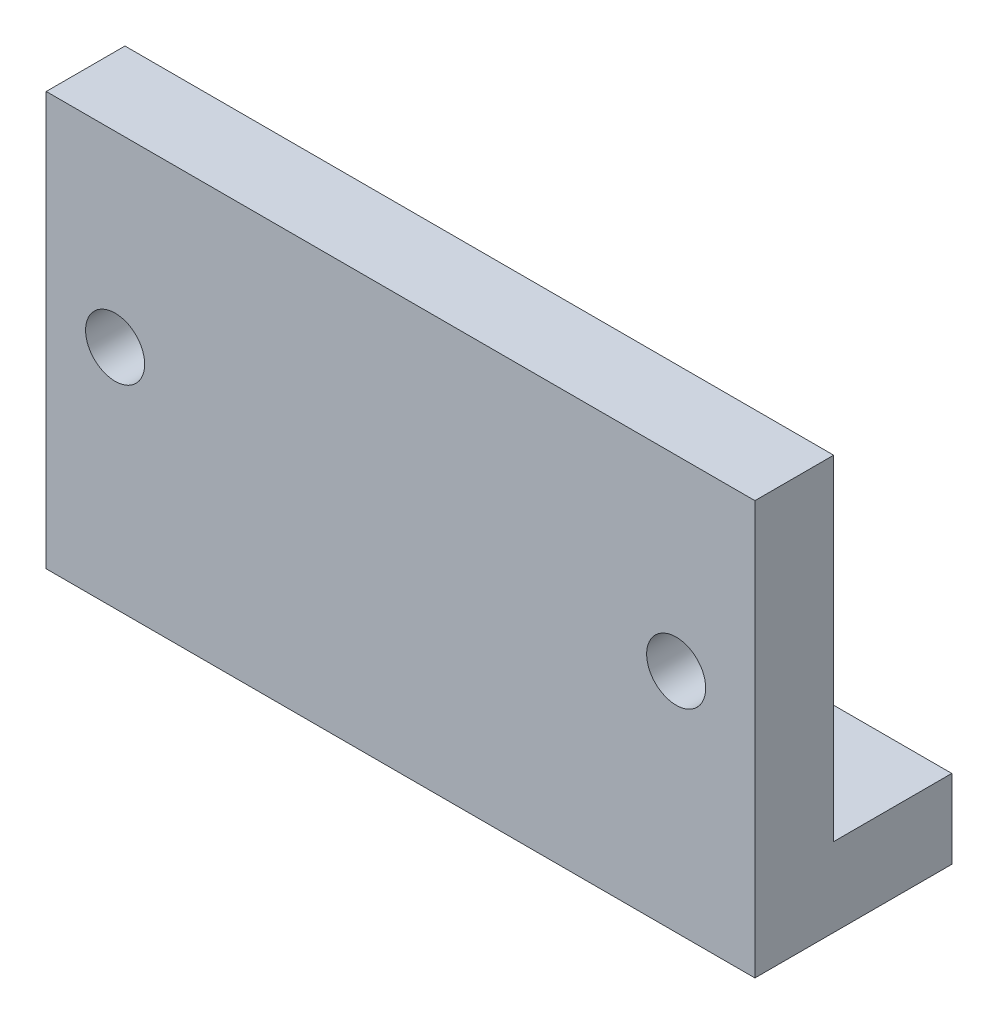
ISO-10303-21;
HEADER;
FILE_DESCRIPTION(('STEP AP214'),'2;1');
FILE_NAME('part.step','',(''),(''),'','','');
FILE_SCHEMA(('AUTOMOTIVE_DESIGN { 1 0 10303 214 1 1 1 1 }'));
ENDSEC;
DATA;
#1=APPLICATION_CONTEXT('core data for automotive mechanical design processes');
#2=APPLICATION_PROTOCOL_DEFINITION('international standard','automotive_design',2000,#1);
#3=PRODUCT_CONTEXT('',#1,'mechanical');
#4=PRODUCT('Part','Part','',(#3));
#5=PRODUCT_RELATED_PRODUCT_CATEGORY('part','',(#4));
#6=PRODUCT_DEFINITION_FORMATION('','',#4);
#7=PRODUCT_DEFINITION_CONTEXT('part definition',#1,'design');
#8=PRODUCT_DEFINITION('design','',#6,#7);
#9=PRODUCT_DEFINITION_SHAPE('','',#8);
#10=(LENGTH_UNIT() NAMED_UNIT(*) SI_UNIT(.MILLI.,.METRE.));
#11=(NAMED_UNIT(*) PLANE_ANGLE_UNIT() SI_UNIT($,.RADIAN.));
#12=(NAMED_UNIT(*) SI_UNIT($,.STERADIAN.) SOLID_ANGLE_UNIT());
#13=UNCERTAINTY_MEASURE_WITH_UNIT(LENGTH_MEASURE(1.E-05),#10,'distance_accuracy_value','');
#14=(GEOMETRIC_REPRESENTATION_CONTEXT(3) GLOBAL_UNCERTAINTY_ASSIGNED_CONTEXT((#13)) GLOBAL_UNIT_ASSIGNED_CONTEXT((#10,
#11,#12)) REPRESENTATION_CONTEXT('',''));
#15=CARTESIAN_POINT('',(0.,0.,0.));
#16=DIRECTION('',(0.,0.,1.));
#17=DIRECTION('',(1.,0.,0.));
#18=AXIS2_PLACEMENT_3D('',#15,#16,#17);
#19=CARTESIAN_POINT('',(0.,7.,0.));
#20=DIRECTION('',(-1.,0.,0.));
#21=DIRECTION('',(0.,0.,1.));
#22=AXIS2_PLACEMENT_3D('',#19,#20,#21);
#23=PLANE('',#22);
#24=DIRECTION('',(0.,-1.,0.));
#25=VECTOR('',#24,1.);
#26=CARTESIAN_POINT('',(0.,7.,0.));
#27=LINE('',#26,#25);
#28=CARTESIAN_POINT('',(0.,4.,0.));
#29=VERTEX_POINT('',#28);
#30=CARTESIAN_POINT('',(0.,0.,0.));
#31=VERTEX_POINT('',#30);
#32=EDGE_CURVE('E11',#29,#31,#27,.T.);
#33=ORIENTED_EDGE('',*,*,#32,.F.);
#34=DIRECTION('',(0.,0.,-1.));
#35=VECTOR('',#34,1.);
#36=CARTESIAN_POINT('',(0.,4.,6.));
#37=LINE('',#36,#35);
#38=CARTESIAN_POINT('',(0.,4.,6.));
#39=VERTEX_POINT('',#38);
#40=EDGE_CURVE('E111',#39,#29,#37,.T.);
#41=ORIENTED_EDGE('',*,*,#40,.F.);
#42=DIRECTION('',(0.,-1.,0.));
#43=VECTOR('',#42,1.);
#44=CARTESIAN_POINT('',(0.,21.,6.));
#45=LINE('',#44,#43);
#46=CARTESIAN_POINT('',(0.,21.,6.));
#47=VERTEX_POINT('',#46);
#48=EDGE_CURVE('E93',#47,#39,#45,.T.);
#49=ORIENTED_EDGE('',*,*,#48,.F.);
#50=DIRECTION('',(0.,0.,-1.));
#51=VECTOR('',#50,1.);
#52=CARTESIAN_POINT('',(0.,21.,10.));
#53=LINE('',#52,#51);
#54=CARTESIAN_POINT('',(0.,21.,10.));
#55=VERTEX_POINT('',#54);
#56=EDGE_CURVE('E143',#55,#47,#53,.T.);
#57=ORIENTED_EDGE('',*,*,#56,.F.);
#58=DIRECTION('',(0.,-1.,0.));
#59=VECTOR('',#58,1.);
#60=CARTESIAN_POINT('',(0.,7.,10.));
#61=LINE('',#60,#59);
#62=CARTESIAN_POINT('',(0.,0.,10.));
#63=VERTEX_POINT('',#62);
#64=EDGE_CURVE('E169',#55,#63,#61,.T.);
#65=ORIENTED_EDGE('',*,*,#64,.T.);
#66=DIRECTION('',(0.,0.,-1.));
#67=VECTOR('',#66,1.);
#68=CARTESIAN_POINT('',(0.,0.,0.));
#69=LINE('',#68,#67);
#70=EDGE_CURVE('E104',#63,#31,#69,.T.);
#71=ORIENTED_EDGE('',*,*,#70,.T.);
#72=EDGE_LOOP('',(#33,#41,#49,#57,#65,#71));
#73=FACE_BOUND('',#72,.T.);
#74=ADVANCED_FACE('F39',(#73),#23,.F.);
#75=CARTESIAN_POINT('',(0.,7.,0.));
#76=DIRECTION('',(0.,0.,1.));
#77=DIRECTION('',(1.,0.,0.));
#78=AXIS2_PLACEMENT_3D('',#75,#76,#77);
#79=PLANE('',#78);
#80=DIRECTION('',(0.,-1.,0.));
#81=VECTOR('',#80,1.);
#82=CARTESIAN_POINT('',(-36.,7.,0.));
#83=LINE('',#82,#81);
#84=CARTESIAN_POINT('',(-36.,4.,0.));
#85=VERTEX_POINT('',#84);
#86=CARTESIAN_POINT('',(-36.,0.,0.));
#87=VERTEX_POINT('',#86);
#88=EDGE_CURVE('E48',#85,#87,#83,.T.);
#89=ORIENTED_EDGE('',*,*,#88,.F.);
#90=DIRECTION('',(-1.,0.,0.));
#91=VECTOR('',#90,1.);
#92=CARTESIAN_POINT('',(0.,4.,0.));
#93=LINE('',#92,#91);
#94=EDGE_CURVE('E116',#29,#85,#93,.T.);
#95=ORIENTED_EDGE('',*,*,#94,.F.);
#96=ORIENTED_EDGE('',*,*,#32,.T.);
#97=DIRECTION('',(-1.,0.,0.));
#98=VECTOR('',#97,1.);
#99=CARTESIAN_POINT('',(0.,0.,0.));
#100=LINE('',#99,#98);
#101=EDGE_CURVE('E161',#31,#87,#100,.T.);
#102=ORIENTED_EDGE('',*,*,#101,.T.);
#103=EDGE_LOOP('',(#89,#95,#96,#102));
#104=FACE_BOUND('',#103,.T.);
#105=ADVANCED_FACE('F212',(#104),#79,.F.);
#106=CARTESIAN_POINT('',(-36.,7.,0.));
#107=DIRECTION('',(1.,0.,0.));
#108=DIRECTION('',(0.,0.,-1.));
#109=AXIS2_PLACEMENT_3D('',#106,#107,#108);
#110=PLANE('',#109);
#111=DIRECTION('',(0.,-1.,0.));
#112=VECTOR('',#111,1.);
#113=CARTESIAN_POINT('',(-36.,21.,6.00000000000001));
#114=LINE('',#113,#112);
#115=CARTESIAN_POINT('',(-36.,21.,6.00000000000001));
#116=VERTEX_POINT('',#115);
#117=CARTESIAN_POINT('',(-36.,4.,6.));
#118=VERTEX_POINT('',#117);
#119=EDGE_CURVE('E105',#116,#118,#114,.T.);
#120=ORIENTED_EDGE('',*,*,#119,.T.);
#121=DIRECTION('',(0.,0.,-1.));
#122=VECTOR('',#121,1.);
#123=CARTESIAN_POINT('',(-36.,4.,6.));
#124=LINE('',#123,#122);
#125=EDGE_CURVE('E114',#118,#85,#124,.T.);
#126=ORIENTED_EDGE('',*,*,#125,.T.);
#127=ORIENTED_EDGE('',*,*,#88,.T.);
#128=DIRECTION('',(0.,0.,1.));
#129=VECTOR('',#128,1.);
#130=CARTESIAN_POINT('',(-36.,0.,0.));
#131=LINE('',#130,#129);
#132=CARTESIAN_POINT('',(-36.,0.,10.));
#133=VERTEX_POINT('',#132);
#134=EDGE_CURVE('E64',#87,#133,#131,.T.);
#135=ORIENTED_EDGE('',*,*,#134,.T.);
#136=DIRECTION('',(0.,-1.,0.));
#137=VECTOR('',#136,1.);
#138=CARTESIAN_POINT('',(-36.,7.,10.));
#139=LINE('',#138,#137);
#140=CARTESIAN_POINT('',(-36.,21.,10.));
#141=VERTEX_POINT('',#140);
#142=EDGE_CURVE('E172',#141,#133,#139,.T.);
#143=ORIENTED_EDGE('',*,*,#142,.F.);
#144=DIRECTION('',(0.,0.,1.));
#145=VECTOR('',#144,1.);
#146=CARTESIAN_POINT('',(-36.,21.,10.));
#147=LINE('',#146,#145);
#148=EDGE_CURVE('E149',#116,#141,#147,.T.);
#149=ORIENTED_EDGE('',*,*,#148,.F.);
#150=EDGE_LOOP('',(#120,#126,#127,#135,#143,#149));
#151=FACE_BOUND('',#150,.T.);
#152=ADVANCED_FACE('F216',(#151),#110,.F.);
#153=CARTESIAN_POINT('',(0.,7.,10.));
#154=DIRECTION('',(0.,0.,-1.));
#155=DIRECTION('',(-1.,0.,0.));
#156=AXIS2_PLACEMENT_3D('',#153,#154,#155);
#157=PLANE('',#156);
#158=CARTESIAN_POINT('',(-32.5,11.5,10.));
#159=DIRECTION('',(0.,0.,1.));
#160=DIRECTION('',(1.,0.,0.));
#161=AXIS2_PLACEMENT_3D('',#158,#159,#160);
#162=CIRCLE('',#161,1.5);
#163=CARTESIAN_POINT('',(-31.,11.5,10.));
#164=VERTEX_POINT('',#163);
#165=EDGE_CURVE('E135',#164,#164,#162,.T.);
#166=ORIENTED_EDGE('',*,*,#165,.F.);
#167=EDGE_LOOP('',(#166));
#168=FACE_BOUND('',#167,.T.);
#169=CARTESIAN_POINT('',(-4.,11.5,10.));
#170=DIRECTION('',(0.,0.,1.));
#171=DIRECTION('',(1.,0.,0.));
#172=AXIS2_PLACEMENT_3D('',#169,#170,#171);
#173=CIRCLE('',#172,1.5);
#174=CARTESIAN_POINT('',(-2.5,11.5,10.));
#175=VERTEX_POINT('',#174);
#176=EDGE_CURVE('E134',#175,#175,#173,.T.);
#177=ORIENTED_EDGE('',*,*,#176,.F.);
#178=EDGE_LOOP('',(#177));
#179=FACE_BOUND('',#178,.T.);
#180=DIRECTION('',(1.,0.,0.));
#181=VECTOR('',#180,1.);
#182=CARTESIAN_POINT('',(0.,0.,10.));
#183=LINE('',#182,#181);
#184=EDGE_CURVE('E56',#133,#63,#183,.T.);
#185=ORIENTED_EDGE('',*,*,#184,.T.);
#186=ORIENTED_EDGE('',*,*,#64,.F.);
#187=DIRECTION('',(1.,0.,0.));
#188=VECTOR('',#187,1.);
#189=CARTESIAN_POINT('',(0.,21.,10.));
#190=LINE('',#189,#188);
#191=EDGE_CURVE('E153',#141,#55,#190,.T.);
#192=ORIENTED_EDGE('',*,*,#191,.F.);
#193=ORIENTED_EDGE('',*,*,#142,.T.);
#194=EDGE_LOOP('',(#185,#186,#192,#193));
#195=FACE_BOUND('',#194,.T.);
#196=ADVANCED_FACE('F221',(#168,#179,#195),#157,.F.);
#197=CARTESIAN_POINT('',(0.,0.,0.));
#198=DIRECTION('',(0.,-1.,0.));
#199=DIRECTION('',(0.,0.,-1.));
#200=AXIS2_PLACEMENT_3D('',#197,#198,#199);
#201=PLANE('',#200);
#202=CARTESIAN_POINT('',(-30.,0.,3.));
#203=DIRECTION('',(0.,-1.,0.));
#204=DIRECTION('',(0.,0.,-1.));
#205=AXIS2_PLACEMENT_3D('',#202,#203,#204);
#206=CIRCLE('',#205,1.5);
#207=CARTESIAN_POINT('',(-30.,0.,1.5));
#208=VERTEX_POINT('',#207);
#209=EDGE_CURVE('E146',#208,#208,#206,.T.);
#210=ORIENTED_EDGE('',*,*,#209,.F.);
#211=EDGE_LOOP('',(#210));
#212=FACE_BOUND('',#211,.T.);
#213=CARTESIAN_POINT('',(-18.,0.,3.));
#214=DIRECTION('',(0.,-1.,0.));
#215=DIRECTION('',(0.,0.,-1.));
#216=AXIS2_PLACEMENT_3D('',#213,#214,#215);
#217=CIRCLE('',#216,1.5);
#218=CARTESIAN_POINT('',(-18.,0.,1.5));
#219=VERTEX_POINT('',#218);
#220=EDGE_CURVE('E181',#219,#219,#217,.T.);
#221=ORIENTED_EDGE('',*,*,#220,.F.);
#222=EDGE_LOOP('',(#221));
#223=FACE_BOUND('',#222,.T.);
#224=CARTESIAN_POINT('',(-6.,0.,3.));
#225=DIRECTION('',(0.,-1.,0.));
#226=DIRECTION('',(0.,0.,-1.));
#227=AXIS2_PLACEMENT_3D('',#224,#225,#226);
#228=CIRCLE('',#227,1.5);
#229=CARTESIAN_POINT('',(-6.,0.,1.5));
#230=VERTEX_POINT('',#229);
#231=EDGE_CURVE('E177',#230,#230,#228,.T.);
#232=ORIENTED_EDGE('',*,*,#231,.F.);
#233=EDGE_LOOP('',(#232));
#234=FACE_BOUND('',#233,.T.);
#235=ORIENTED_EDGE('',*,*,#70,.F.);
#236=ORIENTED_EDGE('',*,*,#184,.F.);
#237=ORIENTED_EDGE('',*,*,#134,.F.);
#238=ORIENTED_EDGE('',*,*,#101,.F.);
#239=EDGE_LOOP('',(#235,#236,#237,#238));
#240=FACE_BOUND('',#239,.T.);
#241=ADVANCED_FACE('F227',(#212,#223,#234,#240),#201,.T.);
#242=CARTESIAN_POINT('',(0.,21.,6.));
#243=DIRECTION('',(0.,0.,1.));
#244=DIRECTION('',(1.,0.,0.));
#245=AXIS2_PLACEMENT_3D('',#242,#243,#244);
#246=PLANE('',#245);
#247=CARTESIAN_POINT('',(-32.5,11.5,6.00000000000001));
#248=DIRECTION('',(0.,0.,1.));
#249=DIRECTION('',(1.,0.,0.));
#250=AXIS2_PLACEMENT_3D('',#247,#248,#249);
#251=CIRCLE('',#250,1.5);
#252=CARTESIAN_POINT('',(-31.,11.5,6.00000000000001));
#253=VERTEX_POINT('',#252);
#254=EDGE_CURVE('E182',#253,#253,#251,.T.);
#255=ORIENTED_EDGE('',*,*,#254,.T.);
#256=EDGE_LOOP('',(#255));
#257=FACE_BOUND('',#256,.T.);
#258=CARTESIAN_POINT('',(-4.,11.5,6.));
#259=DIRECTION('',(0.,0.,1.));
#260=DIRECTION('',(1.,0.,0.));
#261=AXIS2_PLACEMENT_3D('',#258,#259,#260);
#262=CIRCLE('',#261,1.5);
#263=CARTESIAN_POINT('',(-2.5,11.5,6.));
#264=VERTEX_POINT('',#263);
#265=EDGE_CURVE('E139',#264,#264,#262,.T.);
#266=ORIENTED_EDGE('',*,*,#265,.T.);
#267=EDGE_LOOP('',(#266));
#268=FACE_BOUND('',#267,.T.);
#269=ORIENTED_EDGE('',*,*,#48,.T.);
#270=DIRECTION('',(-1.,0.,0.));
#271=VECTOR('',#270,1.);
#272=CARTESIAN_POINT('',(0.,4.,6.));
#273=LINE('',#272,#271);
#274=EDGE_CURVE('E97',#39,#118,#273,.T.);
#275=ORIENTED_EDGE('',*,*,#274,.T.);
#276=ORIENTED_EDGE('',*,*,#119,.F.);
#277=DIRECTION('',(-1.,0.,0.));
#278=VECTOR('',#277,1.);
#279=CARTESIAN_POINT('',(0.,21.,6.));
#280=LINE('',#279,#278);
#281=EDGE_CURVE('E98',#47,#116,#280,.T.);
#282=ORIENTED_EDGE('',*,*,#281,.F.);
#283=EDGE_LOOP('',(#269,#275,#276,#282));
#284=FACE_BOUND('',#283,.T.);
#285=ADVANCED_FACE('F95',(#257,#268,#284),#246,.F.);
#286=CARTESIAN_POINT('',(0.,21.,0.));
#287=DIRECTION('',(0.,1.,0.));
#288=DIRECTION('',(0.,0.,1.));
#289=AXIS2_PLACEMENT_3D('',#286,#287,#288);
#290=PLANE('',#289);
#291=ORIENTED_EDGE('',*,*,#56,.T.);
#292=ORIENTED_EDGE('',*,*,#281,.T.);
#293=ORIENTED_EDGE('',*,*,#148,.T.);
#294=ORIENTED_EDGE('',*,*,#191,.T.);
#295=EDGE_LOOP('',(#291,#292,#293,#294));
#296=FACE_BOUND('',#295,.T.);
#297=ADVANCED_FACE('F234',(#296),#290,.T.);
#298=CARTESIAN_POINT('',(-6.,-3.,3.));
#299=DIRECTION('',(0.,1.,0.));
#300=DIRECTION('',(0.,0.,1.));
#301=AXIS2_PLACEMENT_3D('',#298,#299,#300);
#302=CYLINDRICAL_SURFACE('',#301,1.5);
#303=CARTESIAN_POINT('',(-6.,4.,3.));
#304=DIRECTION('',(0.,-1.,0.));
#305=DIRECTION('',(0.,0.,-1.));
#306=AXIS2_PLACEMENT_3D('',#303,#304,#305);
#307=CIRCLE('',#306,1.5);
#308=CARTESIAN_POINT('',(-6.,4.,1.5));
#309=VERTEX_POINT('',#308);
#310=EDGE_CURVE('E130',#309,#309,#307,.F.);
#311=ORIENTED_EDGE('',*,*,#310,.T.);
#312=EDGE_LOOP('',(#311));
#313=FACE_BOUND('',#312,.T.);
#314=ORIENTED_EDGE('',*,*,#231,.T.);
#315=EDGE_LOOP('',(#314));
#316=FACE_BOUND('',#315,.T.);
#317=ADVANCED_FACE('F237',(#313,#316),#302,.F.);
#318=CARTESIAN_POINT('',(-18.,-3.,3.));
#319=DIRECTION('',(0.,1.,0.));
#320=DIRECTION('',(0.,0.,1.));
#321=AXIS2_PLACEMENT_3D('',#318,#319,#320);
#322=CYLINDRICAL_SURFACE('',#321,1.5);
#323=CARTESIAN_POINT('',(-18.,4.,3.));
#324=DIRECTION('',(0.,-1.,0.));
#325=DIRECTION('',(0.,0.,-1.));
#326=AXIS2_PLACEMENT_3D('',#323,#324,#325);
#327=CIRCLE('',#326,1.5);
#328=CARTESIAN_POINT('',(-18.,4.,1.5));
#329=VERTEX_POINT('',#328);
#330=EDGE_CURVE('E126',#329,#329,#327,.F.);
#331=ORIENTED_EDGE('',*,*,#330,.T.);
#332=EDGE_LOOP('',(#331));
#333=FACE_BOUND('',#332,.T.);
#334=ORIENTED_EDGE('',*,*,#220,.T.);
#335=EDGE_LOOP('',(#334));
#336=FACE_BOUND('',#335,.T.);
#337=ADVANCED_FACE('F241',(#333,#336),#322,.F.);
#338=CARTESIAN_POINT('',(-30.,-3.,3.));
#339=DIRECTION('',(0.,1.,0.));
#340=DIRECTION('',(0.,0.,1.));
#341=AXIS2_PLACEMENT_3D('',#338,#339,#340);
#342=CYLINDRICAL_SURFACE('',#341,1.5);
#343=CARTESIAN_POINT('',(-30.,4.,3.));
#344=DIRECTION('',(0.,-1.,0.));
#345=DIRECTION('',(0.,0.,-1.));
#346=AXIS2_PLACEMENT_3D('',#343,#344,#345);
#347=CIRCLE('',#346,1.5);
#348=CARTESIAN_POINT('',(-30.,4.,1.5));
#349=VERTEX_POINT('',#348);
#350=EDGE_CURVE('E42',#349,#349,#347,.F.);
#351=ORIENTED_EDGE('',*,*,#350,.T.);
#352=EDGE_LOOP('',(#351));
#353=FACE_BOUND('',#352,.T.);
#354=ORIENTED_EDGE('',*,*,#209,.T.);
#355=EDGE_LOOP('',(#354));
#356=FACE_BOUND('',#355,.T.);
#357=ADVANCED_FACE('F208',(#353,#356),#342,.F.);
#358=CARTESIAN_POINT('',(-4.,11.5,0.));
#359=DIRECTION('',(0.,0.,1.));
#360=DIRECTION('',(1.,0.,0.));
#361=AXIS2_PLACEMENT_3D('',#358,#359,#360);
#362=CYLINDRICAL_SURFACE('',#361,1.5);
#363=ORIENTED_EDGE('',*,*,#176,.T.);
#364=EDGE_LOOP('',(#363));
#365=FACE_BOUND('',#364,.T.);
#366=ORIENTED_EDGE('',*,*,#265,.F.);
#367=EDGE_LOOP('',(#366));
#368=FACE_BOUND('',#367,.T.);
#369=ADVANCED_FACE('F199',(#365,#368),#362,.F.);
#370=CARTESIAN_POINT('',(-32.5,11.5,0.));
#371=DIRECTION('',(0.,0.,1.));
#372=DIRECTION('',(1.,0.,0.));
#373=AXIS2_PLACEMENT_3D('',#370,#371,#372);
#374=CYLINDRICAL_SURFACE('',#373,1.5);
#375=ORIENTED_EDGE('',*,*,#165,.T.);
#376=EDGE_LOOP('',(#375));
#377=FACE_BOUND('',#376,.T.);
#378=ORIENTED_EDGE('',*,*,#254,.F.);
#379=EDGE_LOOP('',(#378));
#380=FACE_BOUND('',#379,.T.);
#381=ADVANCED_FACE('F197',(#377,#380),#374,.F.);
#382=CARTESIAN_POINT('',(0.,4.,6.));
#383=DIRECTION('',(0.,-1.,0.));
#384=DIRECTION('',(0.,0.,-1.));
#385=AXIS2_PLACEMENT_3D('',#382,#383,#384);
#386=PLANE('',#385);
#387=ORIENTED_EDGE('',*,*,#330,.F.);
#388=EDGE_LOOP('',(#387));
#389=FACE_BOUND('',#388,.T.);
#390=ORIENTED_EDGE('',*,*,#94,.T.);
#391=ORIENTED_EDGE('',*,*,#125,.F.);
#392=ORIENTED_EDGE('',*,*,#274,.F.);
#393=ORIENTED_EDGE('',*,*,#40,.T.);
#394=EDGE_LOOP('',(#390,#391,#392,#393));
#395=FACE_BOUND('',#394,.T.);
#396=ORIENTED_EDGE('',*,*,#350,.F.);
#397=EDGE_LOOP('',(#396));
#398=FACE_BOUND('',#397,.T.);
#399=ORIENTED_EDGE('',*,*,#310,.F.);
#400=EDGE_LOOP('',(#399));
#401=FACE_BOUND('',#400,.T.);
#402=ADVANCED_FACE('F109',(#389,#395,#398,#401),#386,.F.);
#403=CLOSED_SHELL('',(#74,#105,#152,#196,#241,#285,#297,#317,#337,#357,#369,#381,#402));
#404=MANIFOLD_SOLID_BREP('B2',#403);
#405=ADVANCED_BREP_SHAPE_REPRESENTATION('',(#18,#404),#14);
#406=SHAPE_DEFINITION_REPRESENTATION(#9,#405);
ENDSEC;
END-ISO-10303-21;
